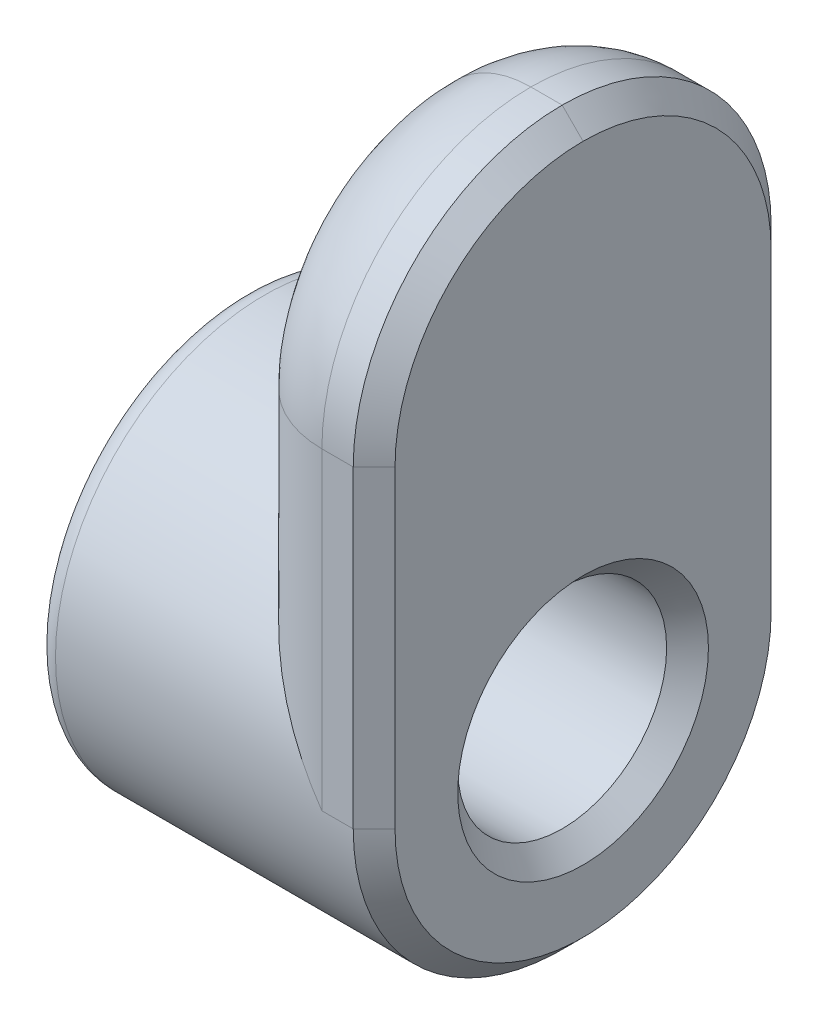
ISO-10303-21;
HEADER;
FILE_DESCRIPTION(('STEP AP214'),'2;1');
FILE_NAME('part.step','',(''),(''),'','','');
FILE_SCHEMA(('AUTOMOTIVE_DESIGN { 1 0 10303 214 1 1 1 1 }'));
ENDSEC;
DATA;
#1=APPLICATION_CONTEXT('core data for automotive mechanical design processes');
#2=APPLICATION_PROTOCOL_DEFINITION('international standard','automotive_design',2000,#1);
#3=PRODUCT_CONTEXT('',#1,'mechanical');
#4=PRODUCT('Part','Part','',(#3));
#5=PRODUCT_RELATED_PRODUCT_CATEGORY('part','',(#4));
#6=PRODUCT_DEFINITION_FORMATION('','',#4);
#7=PRODUCT_DEFINITION_CONTEXT('part definition',#1,'design');
#8=PRODUCT_DEFINITION('design','',#6,#7);
#9=PRODUCT_DEFINITION_SHAPE('','',#8);
#10=(LENGTH_UNIT() NAMED_UNIT(*) SI_UNIT(.MILLI.,.METRE.));
#11=(NAMED_UNIT(*) PLANE_ANGLE_UNIT() SI_UNIT($,.RADIAN.));
#12=(NAMED_UNIT(*) SI_UNIT($,.STERADIAN.) SOLID_ANGLE_UNIT());
#13=UNCERTAINTY_MEASURE_WITH_UNIT(LENGTH_MEASURE(1.E-05),#10,'distance_accuracy_value','');
#14=(GEOMETRIC_REPRESENTATION_CONTEXT(3) GLOBAL_UNCERTAINTY_ASSIGNED_CONTEXT((#13)) GLOBAL_UNIT_ASSIGNED_CONTEXT((#10,
#11,#12)) REPRESENTATION_CONTEXT('',''));
#15=CARTESIAN_POINT('',(0.,0.,0.));
#16=DIRECTION('',(0.,0.,1.));
#17=DIRECTION('',(1.,0.,0.));
#18=AXIS2_PLACEMENT_3D('',#15,#16,#17);
#19=CARTESIAN_POINT('',(6.5,0.,0.));
#20=DIRECTION('',(1.,0.,0.));
#21=DIRECTION('',(0.,0.,-1.));
#22=AXIS2_PLACEMENT_3D('',#19,#20,#21);
#23=PLANE('',#22);
#24=CARTESIAN_POINT('',(6.5,0.,0.));
#25=DIRECTION('',(1.,0.,0.));
#26=DIRECTION('',(0.,0.,-1.));
#27=AXIS2_PLACEMENT_3D('',#24,#25,#26);
#28=CIRCLE('',#27,2.40000000000001);
#29=CARTESIAN_POINT('',(6.5,0.,-2.40000000000001));
#30=VERTEX_POINT('',#29);
#31=EDGE_CURVE('E144',#30,#30,#28,.F.);
#32=ORIENTED_EDGE('',*,*,#31,.T.);
#33=EDGE_LOOP('',(#32));
#34=FACE_BOUND('',#33,.T.);
#35=DIRECTION('',(0.,-1.,0.));
#36=VECTOR('',#35,1.);
#37=CARTESIAN_POINT('',(6.5,0.,3.6));
#38=LINE('',#37,#36);
#39=CARTESIAN_POINT('',(6.5,6.,3.6));
#40=VERTEX_POINT('',#39);
#41=CARTESIAN_POINT('',(6.5,0.,3.6));
#42=VERTEX_POINT('',#41);
#43=EDGE_CURVE('E142',#40,#42,#38,.T.);
#44=ORIENTED_EDGE('',*,*,#43,.T.);
#45=CARTESIAN_POINT('',(6.5,0.,0.));
#46=DIRECTION('',(1.,0.,0.));
#47=DIRECTION('',(0.,0.,-1.));
#48=AXIS2_PLACEMENT_3D('',#45,#46,#47);
#49=CIRCLE('',#48,3.6);
#50=CARTESIAN_POINT('',(6.5,0.,-3.6));
#51=VERTEX_POINT('',#50);
#52=EDGE_CURVE('E123',#42,#51,#49,.T.);
#53=ORIENTED_EDGE('',*,*,#52,.T.);
#54=DIRECTION('',(0.,1.,0.));
#55=VECTOR('',#54,1.);
#56=CARTESIAN_POINT('',(6.5,0.,-3.6));
#57=LINE('',#56,#55);
#58=CARTESIAN_POINT('',(6.5,6.,-3.6));
#59=VERTEX_POINT('',#58);
#60=EDGE_CURVE('E132',#51,#59,#57,.T.);
#61=ORIENTED_EDGE('',*,*,#60,.T.);
#62=CARTESIAN_POINT('',(6.5,6.,0.));
#63=DIRECTION('',(1.,0.,0.));
#64=DIRECTION('',(0.,0.,-1.));
#65=AXIS2_PLACEMENT_3D('',#62,#63,#64);
#66=CIRCLE('',#65,3.6);
#67=CARTESIAN_POINT('',(6.5,9.6,0.));
#68=VERTEX_POINT('',#67);
#69=EDGE_CURVE('E138',#59,#68,#66,.T.);
#70=ORIENTED_EDGE('',*,*,#69,.T.);
#71=CARTESIAN_POINT('',(6.5,6.,0.));
#72=DIRECTION('',(1.,0.,0.));
#73=DIRECTION('',(0.,0.,-1.));
#74=AXIS2_PLACEMENT_3D('',#71,#72,#73);
#75=CIRCLE('',#74,3.6);
#76=EDGE_CURVE('E148',#68,#40,#75,.T.);
#77=ORIENTED_EDGE('',*,*,#76,.T.);
#78=EDGE_LOOP('',(#44,#53,#61,#70,#77));
#79=FACE_BOUND('',#78,.T.);
#80=ADVANCED_FACE('F39',(#34,#79),#23,.T.);
#81=CARTESIAN_POINT('',(0.,0.,0.));
#82=DIRECTION('',(1.,0.,0.));
#83=DIRECTION('',(0.,0.,-1.));
#84=AXIS2_PLACEMENT_3D('',#81,#82,#83);
#85=PLANE('',#84);
#86=CARTESIAN_POINT('',(0.,0.,0.));
#87=DIRECTION('',(1.,0.,0.));
#88=DIRECTION('',(0.,0.,-1.));
#89=AXIS2_PLACEMENT_3D('',#86,#87,#88);
#90=CIRCLE('',#89,2.4);
#91=CARTESIAN_POINT('',(0.,0.,-2.4));
#92=VERTEX_POINT('',#91);
#93=EDGE_CURVE('E311',#92,#92,#90,.T.);
#94=ORIENTED_EDGE('',*,*,#93,.T.);
#95=EDGE_LOOP('',(#94));
#96=FACE_BOUND('',#95,.T.);
#97=CARTESIAN_POINT('',(0.,0.,0.));
#98=DIRECTION('',(1.,0.,0.));
#99=DIRECTION('',(0.,0.,-1.));
#100=AXIS2_PLACEMENT_3D('',#97,#98,#99);
#101=CIRCLE('',#100,3.6);
#102=CARTESIAN_POINT('',(0.,0.,-3.6));
#103=VERTEX_POINT('',#102);
#104=EDGE_CURVE('E308',#103,#103,#101,.F.);
#105=ORIENTED_EDGE('',*,*,#104,.T.);
#106=EDGE_LOOP('',(#105));
#107=FACE_BOUND('',#106,.T.);
#108=ADVANCED_FACE('F213',(#96,#107),#85,.F.);
#109=CARTESIAN_POINT('',(6.5,0.,0.));
#110=DIRECTION('',(-1.,0.,0.));
#111=DIRECTION('',(0.,0.,1.));
#112=AXIS2_PLACEMENT_3D('',#109,#110,#111);
#113=CYLINDRICAL_SURFACE('',#112,4.);
#114=CARTESIAN_POINT('',(0.4,0.,0.));
#115=DIRECTION('',(1.,0.,0.));
#116=DIRECTION('',(0.,0.,-1.));
#117=AXIS2_PLACEMENT_3D('',#114,#115,#116);
#118=CIRCLE('',#117,4.);
#119=CARTESIAN_POINT('',(0.4,0.,-4.));
#120=VERTEX_POINT('',#119);
#121=EDGE_CURVE('E11',#120,#120,#118,.T.);
#122=ORIENTED_EDGE('',*,*,#121,.T.);
#123=EDGE_LOOP('',(#122));
#124=FACE_BOUND('',#123,.T.);
#125=CARTESIAN_POINT('',(3.5,0.,0.));
#126=DIRECTION('',(1.,0.,0.));
#127=DIRECTION('',(0.,0.,-1.));
#128=AXIS2_PLACEMENT_3D('',#125,#126,#127);
#129=CIRCLE('',#128,4.);
#130=CARTESIAN_POINT('',(3.5,3.46410161513775,-2.));
#131=VERTEX_POINT('',#130);
#132=CARTESIAN_POINT('',(3.5,3.46410161513775,2.));
#133=VERTEX_POINT('',#132);
#134=EDGE_CURVE('E288',#131,#133,#129,.T.);
#135=ORIENTED_EDGE('',*,*,#134,.F.);
#136=CARTESIAN_POINT('',(3.5,3.46410161513775,-2.));
#137=CARTESIAN_POINT('',(3.49999947371421,3.42087862186418,-2.07491834338089));
#138=CARTESIAN_POINT('',(3.50420631707593,3.37523066078183,-2.1483211240264));
#139=CARTESIAN_POINT('',(3.52002684492707,3.2798162702369,-2.2913129479948));
#140=CARTESIAN_POINT('',(3.53162176758236,3.23006055011013,-2.36091116818951));
#141=CARTESIAN_POINT('',(3.56102453188309,3.12762028464239,-2.49500224835518));
#142=CARTESIAN_POINT('',(3.57874803759357,3.07498326787609,-2.55955052507026));
#143=CARTESIAN_POINT('',(3.61957089826651,2.96668798495846,-2.68432289764437));
#144=CARTESIAN_POINT('',(3.64267420830814,2.91102751924865,-2.74454376928682));
#145=CARTESIAN_POINT('',(3.69829435929134,2.7863545964326,-2.8715113844122));
#146=CARTESIAN_POINT('',(3.7317658077847,2.71681542116253,-2.9373223562571));
#147=CARTESIAN_POINT('',(3.80404401974558,2.57486112795944,-3.0625242501128));
#148=CARTESIAN_POINT('',(3.84285089746035,2.50244594846631,-3.12191503459983));
#149=CARTESIAN_POINT('',(3.96629847964649,2.280844611762,-3.29126533016796));
#150=CARTESIAN_POINT('',(4.05763890487562,2.12800233707672,-3.39170288904795));
#151=CARTESIAN_POINT('',(4.22310808242817,1.86263901686552,-3.54209761657679));
#152=CARTESIAN_POINT('',(4.29429808852091,1.75161586541853,-3.59818955658879));
#153=CARTESIAN_POINT('',(4.44106491546567,1.52727303615441,-3.69899397995929));
#154=CARTESIAN_POINT('',(4.51664368777439,1.41395235154664,-3.74370135286877));
#155=CARTESIAN_POINT('',(4.74783994880617,1.0719457883728,-3.86121686834213));
#156=CARTESIAN_POINT('',(4.90826489359048,0.840671546342718,-3.91771850305531));
#157=CARTESIAN_POINT('',(5.14074973334404,0.508961990798299,-3.96876195522822));
#158=CARTESIAN_POINT('',(5.21087731290058,0.409340088915174,-3.98025867601468));
#159=CARTESIAN_POINT('',(5.35157480103838,0.209911436732319,-3.99573828799026));
#160=CARTESIAN_POINT('',(5.42214416810795,0.110104990189873,-3.99972905285657));
#161=CARTESIAN_POINT('',(5.49513138114352,0.00688526823941558,-3.99999555530036));
#162=CARTESIAN_POINT('',(5.49756570602145,0.00344261303882461,-3.99999999959275));
#163=CARTESIAN_POINT('',(5.5,0.,-4.));
#164=B_SPLINE_CURVE_WITH_KNOTS('',3,(#136,#137,#138,#139,#140,#141,#142,#143,#144,#145,#146,
#147,#148,#149,#150,#151,#152,#153,#154,#155,#156,#157,#158,#159,#160,#161,#162,#163),
.UNSPECIFIED.,.F.,.F.,(4,2,2,2,2,2,2,2,2,2,2,2,2,4),(0.,0.259184279877111,0.517712977104628,
0.772816996813158,1.02810915717961,1.33193356447284,1.63576447855506,2.24651638518758,
2.67598110613725,3.10563827216722,3.96284212934643,4.32982765178503,4.69642799468956,
4.70907711235755),.UNSPECIFIED.);
#165=CARTESIAN_POINT('',(5.5,0.,-4.));
#166=VERTEX_POINT('',#165);
#167=EDGE_CURVE('E54',#131,#166,#164,.T.);
#168=ORIENTED_EDGE('',*,*,#167,.T.);
#169=DIRECTION('',(1.,0.,0.));
#170=VECTOR('',#169,1.);
#171=CARTESIAN_POINT('',(3.5,0.,-4.));
#172=LINE('',#171,#170);
#173=CARTESIAN_POINT('',(6.09999999999999,0.,-4.));
#174=VERTEX_POINT('',#173);
#175=EDGE_CURVE('E293',#166,#174,#172,.T.);
#176=ORIENTED_EDGE('',*,*,#175,.T.);
#177=CARTESIAN_POINT('',(6.09999999999999,0.,0.));
#178=DIRECTION('',(1.,0.,0.));
#179=DIRECTION('',(0.,0.,-1.));
#180=AXIS2_PLACEMENT_3D('',#177,#178,#179);
#181=CIRCLE('',#180,4.);
#182=CARTESIAN_POINT('',(6.09999999999999,0.,4.));
#183=VERTEX_POINT('',#182);
#184=EDGE_CURVE('E125',#174,#183,#181,.F.);
#185=ORIENTED_EDGE('',*,*,#184,.T.);
#186=DIRECTION('',(1.,0.,0.));
#187=VECTOR('',#186,1.);
#188=CARTESIAN_POINT('',(3.5,0.,4.));
#189=LINE('',#188,#187);
#190=CARTESIAN_POINT('',(5.5,0.,4.));
#191=VERTEX_POINT('',#190);
#192=EDGE_CURVE('E473',#191,#183,#189,.T.);
#193=ORIENTED_EDGE('',*,*,#192,.F.);
#194=CARTESIAN_POINT('',(3.5,3.46410161513775,2.));
#195=CARTESIAN_POINT('',(3.49999947371421,3.42087862186418,2.07491834338089));
#196=CARTESIAN_POINT('',(3.50420631707593,3.37523066078183,2.1483211240264));
#197=CARTESIAN_POINT('',(3.52002684492707,3.2798162702369,2.2913129479948));
#198=CARTESIAN_POINT('',(3.53162176758236,3.23006055011013,2.36091116818951));
#199=CARTESIAN_POINT('',(3.56102453188309,3.12762028464239,2.49500224835518));
#200=CARTESIAN_POINT('',(3.57874803759357,3.07498326787609,2.55955052507026));
#201=CARTESIAN_POINT('',(3.61957089826651,2.96668798495846,2.68432289764437));
#202=CARTESIAN_POINT('',(3.64267420830814,2.91102751924865,2.74454376928682));
#203=CARTESIAN_POINT('',(3.69829435929134,2.7863545964326,2.8715113844122));
#204=CARTESIAN_POINT('',(3.7317658077847,2.71681542116253,2.9373223562571));
#205=CARTESIAN_POINT('',(3.80404401974558,2.57486112795944,3.0625242501128));
#206=CARTESIAN_POINT('',(3.84285089746035,2.50244594846631,3.12191503459983));
#207=CARTESIAN_POINT('',(3.96629847964649,2.280844611762,3.29126533016796));
#208=CARTESIAN_POINT('',(4.05763890487562,2.12800233707672,3.39170288904795));
#209=CARTESIAN_POINT('',(4.22310808242817,1.86263901686552,3.54209761657679));
#210=CARTESIAN_POINT('',(4.29429808852091,1.75161586541853,3.59818955658879));
#211=CARTESIAN_POINT('',(4.44106491546567,1.52727303615441,3.69899397995929));
#212=CARTESIAN_POINT('',(4.51664368777439,1.41395235154664,3.74370135286877));
#213=CARTESIAN_POINT('',(4.74783994880617,1.0719457883728,3.86121686834213));
#214=CARTESIAN_POINT('',(4.90826489359048,0.840671546342718,3.91771850305531));
#215=CARTESIAN_POINT('',(5.14074973334404,0.508961990798299,3.96876195522822));
#216=CARTESIAN_POINT('',(5.21087731290058,0.409340088915174,3.98025867601468));
#217=CARTESIAN_POINT('',(5.35157480103838,0.209911436732319,3.99573828799026));
#218=CARTESIAN_POINT('',(5.42214416810795,0.110104990189873,3.99972905285657));
#219=CARTESIAN_POINT('',(5.49513138114352,0.00688526823941558,3.99999555530036));
#220=CARTESIAN_POINT('',(5.49756570602145,0.00344261303882461,3.99999999959275));
#221=CARTESIAN_POINT('',(5.5,0.,4.));
#222=B_SPLINE_CURVE_WITH_KNOTS('',3,(#194,#195,#196,#197,#198,#199,#200,#201,#202,#203,#204,
#205,#206,#207,#208,#209,#210,#211,#212,#213,#214,#215,#216,#217,#218,#219,#220,#221),
.UNSPECIFIED.,.F.,.F.,(4,2,2,2,2,2,2,2,2,2,2,2,2,4),(0.,0.259184279877111,0.517712977104628,
0.772816996813158,1.02810915717961,1.33193356447284,1.63576447855506,2.24651638518758,
2.67598110613725,3.10563827216722,3.96284212934643,4.32982765178503,4.69642799468956,
4.70907711235755),.UNSPECIFIED.);
#223=EDGE_CURVE('E189',#191,#133,#222,.F.);
#224=ORIENTED_EDGE('',*,*,#223,.T.);
#225=EDGE_LOOP('',(#135,#168,#176,#185,#193,#224));
#226=FACE_BOUND('',#225,.T.);
#227=ADVANCED_FACE('F207',(#124,#226),#113,.T.);
#228=CARTESIAN_POINT('',(6.5,0.,0.));
#229=DIRECTION('',(-1.,0.,0.));
#230=DIRECTION('',(0.,0.,1.));
#231=AXIS2_PLACEMENT_3D('',#228,#229,#230);
#232=CYLINDRICAL_SURFACE('',#231,2.);
#233=CARTESIAN_POINT('',(0.4,0.,0.));
#234=DIRECTION('',(1.,0.,0.));
#235=DIRECTION('',(0.,0.,-1.));
#236=AXIS2_PLACEMENT_3D('',#233,#234,#235);
#237=CIRCLE('',#236,2.);
#238=CARTESIAN_POINT('',(0.399999999999999,0.,2.));
#239=VERTEX_POINT('',#238);
#240=EDGE_CURVE('E47',#239,#239,#237,.F.);
#241=CARTESIAN_POINT('',(6.09999999999999,0.,0.));
#242=DIRECTION('',(1.,0.,0.));
#243=DIRECTION('',(0.,0.,-1.));
#244=AXIS2_PLACEMENT_3D('',#241,#242,#243);
#245=CIRCLE('',#244,2.);
#246=CARTESIAN_POINT('',(6.09999999999999,0.,2.));
#247=VERTEX_POINT('',#246);
#248=EDGE_CURVE('E139',#247,#247,#245,.T.);
#249=CARTESIAN_POINT('',(0.399999999999999,0.,2.));
#250=CARTESIAN_POINT('',(0.459374999999999,0.,2.));
#251=CARTESIAN_POINT('',(0.518749999999999,0.,2.));
#252=CARTESIAN_POINT('',(0.637499999999999,0.,2.));
#253=CARTESIAN_POINT('',(0.696874999999999,0.,2.));
#254=CARTESIAN_POINT('',(0.815624999999999,0.,2.));
#255=CARTESIAN_POINT('',(0.874999999999999,0.,2.));
#256=CARTESIAN_POINT('',(0.993749999999999,0.,2.));
#257=CARTESIAN_POINT('',(1.053125,0.,2.));
#258=CARTESIAN_POINT('',(1.171875,0.,2.));
#259=CARTESIAN_POINT('',(1.23125,0.,2.));
#260=CARTESIAN_POINT('',(1.35,0.,2.));
#261=CARTESIAN_POINT('',(1.409375,0.,2.));
#262=CARTESIAN_POINT('',(1.528125,0.,2.));
#263=CARTESIAN_POINT('',(1.5875,0.,2.));
#264=CARTESIAN_POINT('',(1.70625,0.,2.));
#265=CARTESIAN_POINT('',(1.765625,0.,2.));
#266=CARTESIAN_POINT('',(1.884375,0.,2.));
#267=CARTESIAN_POINT('',(1.94375,0.,2.));
#268=CARTESIAN_POINT('',(2.0625,0.,2.));
#269=CARTESIAN_POINT('',(2.121875,0.,2.));
#270=CARTESIAN_POINT('',(2.240625,0.,2.));
#271=CARTESIAN_POINT('',(2.3,0.,2.));
#272=CARTESIAN_POINT('',(2.41875,0.,2.));
#273=CARTESIAN_POINT('',(2.478125,0.,2.));
#274=CARTESIAN_POINT('',(2.596875,0.,2.));
#275=CARTESIAN_POINT('',(2.65625,0.,2.));
#276=CARTESIAN_POINT('',(2.775,0.,2.));
#277=CARTESIAN_POINT('',(2.834375,0.,2.));
#278=CARTESIAN_POINT('',(2.953125,0.,2.));
#279=CARTESIAN_POINT('',(3.0125,0.,2.));
#280=CARTESIAN_POINT('',(3.13125,0.,2.));
#281=CARTESIAN_POINT('',(3.190625,0.,2.));
#282=CARTESIAN_POINT('',(3.309375,0.,2.));
#283=CARTESIAN_POINT('',(3.36875,0.,2.));
#284=CARTESIAN_POINT('',(3.4875,0.,2.));
#285=CARTESIAN_POINT('',(3.546875,0.,2.));
#286=CARTESIAN_POINT('',(3.665625,0.,2.));
#287=CARTESIAN_POINT('',(3.725,0.,2.));
#288=CARTESIAN_POINT('',(3.84375,0.,2.));
#289=CARTESIAN_POINT('',(3.903125,0.,2.));
#290=CARTESIAN_POINT('',(4.021875,0.,2.));
#291=CARTESIAN_POINT('',(4.08125,0.,2.));
#292=CARTESIAN_POINT('',(4.2,0.,2.));
#293=CARTESIAN_POINT('',(4.259375,0.,2.));
#294=CARTESIAN_POINT('',(4.378125,0.,2.));
#295=CARTESIAN_POINT('',(4.4375,0.,2.));
#296=CARTESIAN_POINT('',(4.55625,0.,2.));
#297=CARTESIAN_POINT('',(4.61562499999999,0.,2.));
#298=CARTESIAN_POINT('',(4.73437499999999,0.,2.));
#299=CARTESIAN_POINT('',(4.79374999999999,0.,2.));
#300=CARTESIAN_POINT('',(4.91249999999999,0.,2.));
#301=CARTESIAN_POINT('',(4.97187499999999,0.,2.));
#302=CARTESIAN_POINT('',(5.09062499999999,0.,2.));
#303=CARTESIAN_POINT('',(5.14999999999999,0.,2.));
#304=CARTESIAN_POINT('',(5.26874999999999,0.,2.));
#305=CARTESIAN_POINT('',(5.32812499999999,0.,2.));
#306=CARTESIAN_POINT('',(5.44687499999999,0.,2.));
#307=CARTESIAN_POINT('',(5.50624999999999,0.,2.));
#308=CARTESIAN_POINT('',(5.62499999999999,0.,2.));
#309=CARTESIAN_POINT('',(5.68437499999999,0.,2.));
#310=CARTESIAN_POINT('',(5.80312499999999,0.,2.));
#311=CARTESIAN_POINT('',(5.86249999999999,0.,2.));
#312=CARTESIAN_POINT('',(5.98124999999999,0.,2.));
#313=CARTESIAN_POINT('',(6.04062499999999,0.,2.));
#314=CARTESIAN_POINT('',(6.09999999999999,0.,2.));
#315=B_SPLINE_CURVE_WITH_KNOTS('',3,(#249,#250,#251,#252,#253,#254,#255,#256,#257,#258,#259,
#260,#261,#262,#263,#264,#265,#266,#267,#268,#269,#270,#271,#272,#273,#274,#275,#276,#277,#278,
#279,#280,#281,#282,#283,#284,#285,#286,#287,#288,#289,#290,#291,#292,#293,#294,#295,#296,#297,
#298,#299,#300,#301,#302,#303,#304,#305,#306,#307,#308,#309,#310,#311,#312,#313,#314),
.UNSPECIFIED.,.F.,.F.,(4,2,2,2,2,2,2,2,2,2,2,2,2,2,2,2,2,2,2,2,2,2,2,2,2,2,2,2,2,2,2,2,4),(0.,
0.178124999999999,0.35625,0.534374999999999,0.7125,0.890624999999999,1.06875,1.246875,1.425,
1.603125,1.78125,1.959375,2.1375,2.315625,2.49375,2.671875,2.85,3.028125,3.20625,3.384375,
3.5625,3.740625,3.91875,4.096875,4.275,4.453125,4.63124999999999,4.80937499999999,
4.98749999999999,5.165625,5.34374999999999,5.52187499999999,5.69999999999999),.UNSPECIFIED.);
#316=EDGE_CURVE('BSEAM212',#239,#247,#315,.T.);
#317=ORIENTED_EDGE('',*,*,#240,.T.);
#318=ORIENTED_EDGE('',*,*,#248,.T.);
#319=ORIENTED_EDGE('',*,*,#316,.T.);
#320=ORIENTED_EDGE('',*,*,#316,.F.);
#321=EDGE_LOOP('',(#317,#319,#318,#320));
#322=FACE_BOUND('',#321,.T.);
#323=ADVANCED_FACE('F212',(#322),#232,.F.);
#324=CARTESIAN_POINT('',(3.5,0.,0.));
#325=DIRECTION('',(1.,0.,0.));
#326=DIRECTION('',(0.,0.,-1.));
#327=AXIS2_PLACEMENT_3D('',#324,#325,#326);
#328=PLANE('',#327);
#329=ORIENTED_EDGE('',*,*,#134,.T.);
#330=DIRECTION('',(0.,-1.,0.));
#331=VECTOR('',#330,1.);
#332=CARTESIAN_POINT('',(3.5,6.,2.));
#333=LINE('',#332,#331);
#334=CARTESIAN_POINT('',(3.5,6.,2.));
#335=VERTEX_POINT('',#334);
#336=EDGE_CURVE('E182',#133,#335,#333,.F.);
#337=ORIENTED_EDGE('',*,*,#336,.T.);
#338=CARTESIAN_POINT('',(3.5,6.,0.));
#339=DIRECTION('',(1.,0.,0.));
#340=DIRECTION('',(0.,0.,-1.));
#341=AXIS2_PLACEMENT_3D('',#338,#339,#340);
#342=CIRCLE('',#341,2.);
#343=CARTESIAN_POINT('',(3.5,8.,0.));
#344=VERTEX_POINT('',#343);
#345=EDGE_CURVE('E180',#335,#344,#342,.F.);
#346=ORIENTED_EDGE('',*,*,#345,.T.);
#347=CARTESIAN_POINT('',(3.5,6.,0.));
#348=DIRECTION('',(1.,0.,0.));
#349=DIRECTION('',(0.,0.,-1.));
#350=AXIS2_PLACEMENT_3D('',#347,#348,#349);
#351=CIRCLE('',#350,2.);
#352=CARTESIAN_POINT('',(3.5,6.,-2.));
#353=VERTEX_POINT('',#352);
#354=EDGE_CURVE('E178',#344,#353,#351,.F.);
#355=ORIENTED_EDGE('',*,*,#354,.T.);
#356=DIRECTION('',(0.,1.,0.));
#357=VECTOR('',#356,1.);
#358=CARTESIAN_POINT('',(3.5,0.,-2.));
#359=LINE('',#358,#357);
#360=EDGE_CURVE('E176',#353,#131,#359,.F.);
#361=ORIENTED_EDGE('',*,*,#360,.T.);
#362=EDGE_LOOP('',(#329,#337,#346,#355,#361));
#363=FACE_BOUND('',#362,.T.);
#364=ADVANCED_FACE('F275',(#363),#328,.F.);
#365=CARTESIAN_POINT('',(3.5,0.,4.));
#366=DIRECTION('',(0.,0.,1.));
#367=DIRECTION('',(1.,0.,0.));
#368=AXIS2_PLACEMENT_3D('',#365,#366,#367);
#369=PLANE('',#368);
#370=DIRECTION('',(1.,0.,0.));
#371=VECTOR('',#370,1.);
#372=CARTESIAN_POINT('',(3.5,6.,4.));
#373=LINE('',#372,#371);
#374=CARTESIAN_POINT('',(6.09999999999999,6.,4.));
#375=VERTEX_POINT('',#374);
#376=CARTESIAN_POINT('',(5.5,6.,4.));
#377=VERTEX_POINT('',#376);
#378=EDGE_CURVE('E478',#375,#377,#373,.F.);
#379=ORIENTED_EDGE('',*,*,#378,.T.);
#380=DIRECTION('',(0.,-1.,0.));
#381=VECTOR('',#380,1.);
#382=CARTESIAN_POINT('',(5.5,0.,4.));
#383=LINE('',#382,#381);
#384=EDGE_CURVE('E163',#377,#191,#383,.T.);
#385=ORIENTED_EDGE('',*,*,#384,.T.);
#386=ORIENTED_EDGE('',*,*,#192,.T.);
#387=DIRECTION('',(0.,1.,0.));
#388=VECTOR('',#387,1.);
#389=CARTESIAN_POINT('',(6.09999999999999,0.,4.));
#390=LINE('',#389,#388);
#391=EDGE_CURVE('E153',#183,#375,#390,.T.);
#392=ORIENTED_EDGE('',*,*,#391,.T.);
#393=EDGE_LOOP('',(#379,#385,#386,#392));
#394=FACE_BOUND('',#393,.T.);
#395=ADVANCED_FACE('F277',(#394),#369,.T.);
#396=CARTESIAN_POINT('',(3.5,0.,-4.));
#397=DIRECTION('',(0.,0.,-1.));
#398=DIRECTION('',(-1.,0.,0.));
#399=AXIS2_PLACEMENT_3D('',#396,#397,#398);
#400=PLANE('',#399);
#401=ORIENTED_EDGE('',*,*,#175,.F.);
#402=DIRECTION('',(0.,1.,0.));
#403=VECTOR('',#402,1.);
#404=CARTESIAN_POINT('',(5.5,6.,-4.));
#405=LINE('',#404,#403);
#406=CARTESIAN_POINT('',(5.5,6.,-4.));
#407=VERTEX_POINT('',#406);
#408=EDGE_CURVE('E61',#166,#407,#405,.T.);
#409=ORIENTED_EDGE('',*,*,#408,.T.);
#410=DIRECTION('',(1.,0.,0.));
#411=VECTOR('',#410,1.);
#412=CARTESIAN_POINT('',(3.5,6.,-4.));
#413=LINE('',#412,#411);
#414=CARTESIAN_POINT('',(6.09999999999999,6.,-4.));
#415=VERTEX_POINT('',#414);
#416=EDGE_CURVE('E292',#407,#415,#413,.T.);
#417=ORIENTED_EDGE('',*,*,#416,.T.);
#418=DIRECTION('',(0.,-1.,0.));
#419=VECTOR('',#418,1.);
#420=CARTESIAN_POINT('',(6.09999999999999,0.,-4.));
#421=LINE('',#420,#419);
#422=EDGE_CURVE('E161',#415,#174,#421,.T.);
#423=ORIENTED_EDGE('',*,*,#422,.T.);
#424=EDGE_LOOP('',(#401,#409,#417,#423));
#425=FACE_BOUND('',#424,.T.);
#426=ADVANCED_FACE('F225',(#425),#400,.T.);
#427=CARTESIAN_POINT('',(3.5,6.,0.));
#428=DIRECTION('',(1.,0.,0.));
#429=DIRECTION('',(0.,0.,-1.));
#430=AXIS2_PLACEMENT_3D('',#427,#428,#429);
#431=CYLINDRICAL_SURFACE('',#430,4.);
#432=DIRECTION('',(1.,0.,0.));
#433=VECTOR('',#432,1.);
#434=CARTESIAN_POINT('',(3.5,10.,0.));
#435=LINE('',#434,#433);
#436=CARTESIAN_POINT('',(5.5,10.,0.));
#437=VERTEX_POINT('',#436);
#438=CARTESIAN_POINT('',(6.09999999999999,10.,0.));
#439=VERTEX_POINT('',#438);
#440=EDGE_CURVE('E173',#437,#439,#435,.T.);
#441=ORIENTED_EDGE('',*,*,#440,.F.);
#442=CARTESIAN_POINT('',(5.5,6.,0.));
#443=DIRECTION('',(1.,0.,0.));
#444=DIRECTION('',(0.,0.,-1.));
#445=AXIS2_PLACEMENT_3D('',#442,#443,#444);
#446=CIRCLE('',#445,4.);
#447=EDGE_CURVE('E184',#437,#377,#446,.T.);
#448=ORIENTED_EDGE('',*,*,#447,.T.);
#449=ORIENTED_EDGE('',*,*,#378,.F.);
#450=CARTESIAN_POINT('',(6.09999999999999,6.,0.));
#451=DIRECTION('',(1.,0.,0.));
#452=DIRECTION('',(0.,0.,-1.));
#453=AXIS2_PLACEMENT_3D('',#450,#451,#452);
#454=CIRCLE('',#453,4.);
#455=EDGE_CURVE('E155',#375,#439,#454,.F.);
#456=ORIENTED_EDGE('',*,*,#455,.T.);
#457=EDGE_LOOP('',(#441,#448,#449,#456));
#458=FACE_BOUND('',#457,.T.);
#459=ADVANCED_FACE('F221',(#458),#431,.T.);
#460=CARTESIAN_POINT('',(3.5,6.,0.));
#461=DIRECTION('',(1.,0.,0.));
#462=DIRECTION('',(0.,0.,-1.));
#463=AXIS2_PLACEMENT_3D('',#460,#461,#462);
#464=CYLINDRICAL_SURFACE('',#463,4.);
#465=ORIENTED_EDGE('',*,*,#416,.F.);
#466=CARTESIAN_POINT('',(5.5,6.,0.));
#467=DIRECTION('',(1.,0.,0.));
#468=DIRECTION('',(0.,0.,-1.));
#469=AXIS2_PLACEMENT_3D('',#466,#467,#468);
#470=CIRCLE('',#469,4.);
#471=EDGE_CURVE('E186',#407,#437,#470,.T.);
#472=ORIENTED_EDGE('',*,*,#471,.T.);
#473=ORIENTED_EDGE('',*,*,#440,.T.);
#474=CARTESIAN_POINT('',(6.09999999999999,6.,0.));
#475=DIRECTION('',(1.,0.,0.));
#476=DIRECTION('',(0.,0.,-1.));
#477=AXIS2_PLACEMENT_3D('',#474,#475,#476);
#478=CIRCLE('',#477,4.);
#479=EDGE_CURVE('E158',#439,#415,#478,.F.);
#480=ORIENTED_EDGE('',*,*,#479,.T.);
#481=EDGE_LOOP('',(#465,#472,#473,#480));
#482=FACE_BOUND('',#481,.T.);
#483=ADVANCED_FACE('F216',(#482),#464,.T.);
#484=CARTESIAN_POINT('',(6.09999999999999,0.,0.));
#485=DIRECTION('',(1.,0.,0.));
#486=DIRECTION('',(0.,0.,-1.));
#487=AXIS2_PLACEMENT_3D('',#484,#485,#486);
#488=CONICAL_SURFACE('',#487,2.,0.78539816339745);
#489=ORIENTED_EDGE('',*,*,#31,.F.);
#490=EDGE_LOOP('',(#489));
#491=FACE_BOUND('',#490,.T.);
#492=ORIENTED_EDGE('',*,*,#248,.F.);
#493=EDGE_LOOP('',(#492));
#494=FACE_BOUND('',#493,.T.);
#495=ADVANCED_FACE('F220',(#491,#494),#488,.F.);
#496=CARTESIAN_POINT('',(6.5,6.,0.));
#497=DIRECTION('',(-1.,0.,0.));
#498=DIRECTION('',(0.,0.,1.));
#499=AXIS2_PLACEMENT_3D('',#496,#497,#498);
#500=CONICAL_SURFACE('',#499,3.6,0.785398163397446);
#501=DIRECTION('',(-0.707106781186549,0.,0.707106781186546));
#502=VECTOR('',#501,1.);
#503=CARTESIAN_POINT('',(6.5,6.,3.6));
#504=LINE('',#503,#502);
#505=EDGE_CURVE('E167',#40,#375,#504,.T.);
#506=ORIENTED_EDGE('',*,*,#505,.F.);
#507=ORIENTED_EDGE('',*,*,#76,.F.);
#508=DIRECTION('',(0.707106781186549,-0.707106781186546,0.));
#509=VECTOR('',#508,1.);
#510=CARTESIAN_POINT('',(6.09999999999999,10.,0.));
#511=LINE('',#510,#509);
#512=EDGE_CURVE('E170',#439,#68,#511,.T.);
#513=ORIENTED_EDGE('',*,*,#512,.F.);
#514=ORIENTED_EDGE('',*,*,#455,.F.);
#515=EDGE_LOOP('',(#506,#507,#513,#514));
#516=FACE_BOUND('',#515,.T.);
#517=ADVANCED_FACE('F233',(#516),#500,.T.);
#518=CARTESIAN_POINT('',(6.5,6.,0.));
#519=DIRECTION('',(-1.,0.,0.));
#520=DIRECTION('',(0.,0.,1.));
#521=AXIS2_PLACEMENT_3D('',#518,#519,#520);
#522=CONICAL_SURFACE('',#521,3.6,0.785398163397446);
#523=ORIENTED_EDGE('',*,*,#512,.T.);
#524=ORIENTED_EDGE('',*,*,#69,.F.);
#525=DIRECTION('',(0.707106781186549,0.,0.707106781186546));
#526=VECTOR('',#525,1.);
#527=CARTESIAN_POINT('',(6.09999999999999,6.,-4.));
#528=LINE('',#527,#526);
#529=EDGE_CURVE('E135',#415,#59,#528,.T.);
#530=ORIENTED_EDGE('',*,*,#529,.F.);
#531=ORIENTED_EDGE('',*,*,#479,.F.);
#532=EDGE_LOOP('',(#523,#524,#530,#531));
#533=FACE_BOUND('',#532,.T.);
#534=ADVANCED_FACE('F253',(#533),#522,.T.);
#535=CARTESIAN_POINT('',(6.5,0.,3.6));
#536=DIRECTION('',(-0.707106781186546,0.,-0.707106781186549));
#537=DIRECTION('',(0.,-1.,0.));
#538=AXIS2_PLACEMENT_3D('',#535,#536,#537);
#539=PLANE('',#538);
#540=ORIENTED_EDGE('',*,*,#505,.T.);
#541=ORIENTED_EDGE('',*,*,#391,.F.);
#542=DIRECTION('',(-0.707106781186549,0.,0.707106781186546));
#543=VECTOR('',#542,1.);
#544=CARTESIAN_POINT('',(6.5,0.,3.6));
#545=LINE('',#544,#543);
#546=EDGE_CURVE('E128',#42,#183,#545,.T.);
#547=ORIENTED_EDGE('',*,*,#546,.F.);
#548=ORIENTED_EDGE('',*,*,#43,.F.);
#549=EDGE_LOOP('',(#540,#541,#547,#548));
#550=FACE_BOUND('',#549,.T.);
#551=ADVANCED_FACE('F247',(#550),#539,.F.);
#552=CARTESIAN_POINT('',(6.5,0.,-3.6));
#553=DIRECTION('',(-0.707106781186546,0.,0.707106781186549));
#554=DIRECTION('',(0.,1.,0.));
#555=AXIS2_PLACEMENT_3D('',#552,#553,#554);
#556=PLANE('',#555);
#557=ORIENTED_EDGE('',*,*,#529,.T.);
#558=ORIENTED_EDGE('',*,*,#60,.F.);
#559=DIRECTION('',(0.707106781186549,0.,0.707106781186546));
#560=VECTOR('',#559,1.);
#561=CARTESIAN_POINT('',(6.09999999999999,0.,-4.));
#562=LINE('',#561,#560);
#563=EDGE_CURVE('E118',#174,#51,#562,.T.);
#564=ORIENTED_EDGE('',*,*,#563,.F.);
#565=ORIENTED_EDGE('',*,*,#422,.F.);
#566=EDGE_LOOP('',(#557,#558,#564,#565));
#567=FACE_BOUND('',#566,.T.);
#568=ADVANCED_FACE('F133',(#567),#556,.F.);
#569=CARTESIAN_POINT('',(6.5,0.,0.));
#570=DIRECTION('',(-1.,0.,0.));
#571=DIRECTION('',(0.,0.,1.));
#572=AXIS2_PLACEMENT_3D('',#569,#570,#571);
#573=CONICAL_SURFACE('',#572,3.6,0.785398163397446);
#574=ORIENTED_EDGE('',*,*,#546,.T.);
#575=ORIENTED_EDGE('',*,*,#184,.F.);
#576=ORIENTED_EDGE('',*,*,#563,.T.);
#577=ORIENTED_EDGE('',*,*,#52,.F.);
#578=EDGE_LOOP('',(#574,#575,#576,#577));
#579=FACE_BOUND('',#578,.T.);
#580=ADVANCED_FACE('F121',(#579),#573,.T.);
#581=CARTESIAN_POINT('',(5.5,0.,-2.));
#582=DIRECTION('',(0.,-1.,0.));
#583=DIRECTION('',(0.,0.,-1.));
#584=AXIS2_PLACEMENT_3D('',#581,#582,#583);
#585=CYLINDRICAL_SURFACE('',#584,2.);
#586=ORIENTED_EDGE('',*,*,#167,.F.);
#587=ORIENTED_EDGE('',*,*,#360,.F.);
#588=CARTESIAN_POINT('',(5.5,6.,-2.));
#589=DIRECTION('',(0.,1.,0.));
#590=DIRECTION('',(0.,0.,1.));
#591=AXIS2_PLACEMENT_3D('',#588,#589,#590);
#592=CIRCLE('',#591,2.);
#593=EDGE_CURVE('E129',#407,#353,#592,.T.);
#594=ORIENTED_EDGE('',*,*,#593,.F.);
#595=ORIENTED_EDGE('',*,*,#408,.F.);
#596=EDGE_LOOP('',(#586,#587,#594,#595));
#597=FACE_BOUND('',#596,.T.);
#598=ADVANCED_FACE('F241',(#597),#585,.T.);
#599=CARTESIAN_POINT('',(5.5,6.,0.));
#600=DIRECTION('',(1.,0.,0.));
#601=DIRECTION('',(0.,0.,-1.));
#602=AXIS2_PLACEMENT_3D('',#599,#600,#601);
#603=DEGENERATE_TOROIDAL_SURFACE('',#602,2.,2.,.T.);
#604=ORIENTED_EDGE('',*,*,#593,.T.);
#605=ORIENTED_EDGE('',*,*,#354,.F.);
#606=CARTESIAN_POINT('',(5.5,8.,0.));
#607=DIRECTION('',(0.,0.,1.));
#608=DIRECTION('',(1.,0.,0.));
#609=AXIS2_PLACEMENT_3D('',#606,#607,#608);
#610=CIRCLE('',#609,2.);
#611=EDGE_CURVE('E302',#437,#344,#610,.T.);
#612=ORIENTED_EDGE('',*,*,#611,.F.);
#613=ORIENTED_EDGE('',*,*,#471,.F.);
#614=EDGE_LOOP('',(#604,#605,#612,#613));
#615=FACE_BOUND('',#614,.T.);
#616=ADVANCED_FACE('F347',(#615),#603,.T.);
#617=CARTESIAN_POINT('',(5.5,6.,0.));
#618=DIRECTION('',(1.,0.,0.));
#619=DIRECTION('',(0.,0.,-1.));
#620=AXIS2_PLACEMENT_3D('',#617,#618,#619);
#621=DEGENERATE_TOROIDAL_SURFACE('',#620,2.,2.,.T.);
#622=ORIENTED_EDGE('',*,*,#611,.T.);
#623=ORIENTED_EDGE('',*,*,#345,.F.);
#624=CARTESIAN_POINT('',(5.5,6.,2.));
#625=DIRECTION('',(0.,-1.,0.));
#626=DIRECTION('',(0.,0.,-1.));
#627=AXIS2_PLACEMENT_3D('',#624,#625,#626);
#628=CIRCLE('',#627,2.);
#629=EDGE_CURVE('E299',#377,#335,#628,.T.);
#630=ORIENTED_EDGE('',*,*,#629,.F.);
#631=ORIENTED_EDGE('',*,*,#447,.F.);
#632=EDGE_LOOP('',(#622,#623,#630,#631));
#633=FACE_BOUND('',#632,.T.);
#634=ADVANCED_FACE('F340',(#633),#621,.T.);
#635=CARTESIAN_POINT('',(5.5,0.,2.));
#636=DIRECTION('',(0.,1.,0.));
#637=DIRECTION('',(0.,0.,1.));
#638=AXIS2_PLACEMENT_3D('',#635,#636,#637);
#639=CYLINDRICAL_SURFACE('',#638,2.);
#640=ORIENTED_EDGE('',*,*,#629,.T.);
#641=ORIENTED_EDGE('',*,*,#336,.F.);
#642=ORIENTED_EDGE('',*,*,#223,.F.);
#643=ORIENTED_EDGE('',*,*,#384,.F.);
#644=EDGE_LOOP('',(#640,#641,#642,#643));
#645=FACE_BOUND('',#644,.T.);
#646=ADVANCED_FACE('F203',(#645),#639,.T.);
#647=CARTESIAN_POINT('',(0.4,0.,0.));
#648=DIRECTION('',(1.,0.,0.));
#649=DIRECTION('',(0.,0.,-1.));
#650=AXIS2_PLACEMENT_3D('',#647,#648,#649);
#651=TOROIDAL_SURFACE('',#650,2.4,0.4);
#652=ORIENTED_EDGE('',*,*,#240,.F.);
#653=EDGE_LOOP('',(#652));
#654=FACE_BOUND('',#653,.T.);
#655=ORIENTED_EDGE('',*,*,#93,.F.);
#656=EDGE_LOOP('',(#655));
#657=FACE_BOUND('',#656,.T.);
#658=ADVANCED_FACE('F317',(#654,#657),#651,.T.);
#659=CARTESIAN_POINT('',(0.4,0.,0.));
#660=DIRECTION('',(1.,0.,0.));
#661=DIRECTION('',(0.,0.,-1.));
#662=AXIS2_PLACEMENT_3D('',#659,#660,#661);
#663=TOROIDAL_SURFACE('',#662,3.6,0.4);
#664=ORIENTED_EDGE('',*,*,#104,.F.);
#665=EDGE_LOOP('',(#664));
#666=FACE_BOUND('',#665,.T.);
#667=ORIENTED_EDGE('',*,*,#121,.F.);
#668=EDGE_LOOP('',(#667));
#669=FACE_BOUND('',#668,.T.);
#670=ADVANCED_FACE('F41',(#666,#669),#663,.T.);
#671=CLOSED_SHELL('',(#80,#108,#227,#323,#364,#395,#426,#459,#483,#495,#517,#534,#551,#568,#580,
#598,#616,#634,#646,#658,#670));
#672=MANIFOLD_SOLID_BREP('B2',#671);
#673=ADVANCED_BREP_SHAPE_REPRESENTATION('',(#18,#672),#14);
#674=SHAPE_DEFINITION_REPRESENTATION(#9,#673);
ENDSEC;
END-ISO-10303-21;
